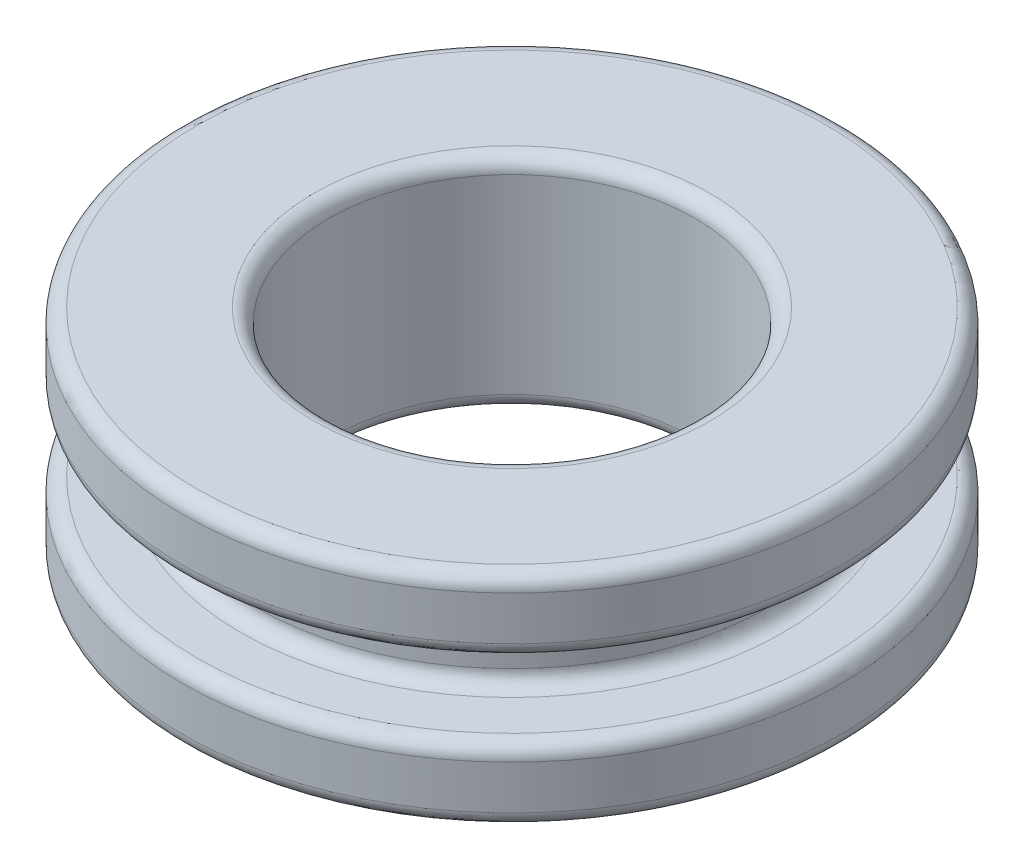
ISO-10303-21;
HEADER;
FILE_DESCRIPTION(('STEP AP214'),'2;1');
FILE_NAME('part.step','',(''),(''),'','','');
FILE_SCHEMA(('AUTOMOTIVE_DESIGN { 1 0 10303 214 1 1 1 1 }'));
ENDSEC;
DATA;
#1=APPLICATION_CONTEXT('core data for automotive mechanical design processes');
#2=APPLICATION_PROTOCOL_DEFINITION('international standard','automotive_design',2000,#1);
#3=PRODUCT_CONTEXT('',#1,'mechanical');
#4=PRODUCT('Part','Part','',(#3));
#5=PRODUCT_RELATED_PRODUCT_CATEGORY('part','',(#4));
#6=PRODUCT_DEFINITION_FORMATION('','',#4);
#7=PRODUCT_DEFINITION_CONTEXT('part definition',#1,'design');
#8=PRODUCT_DEFINITION('design','',#6,#7);
#9=PRODUCT_DEFINITION_SHAPE('','',#8);
#10=(LENGTH_UNIT() NAMED_UNIT(*) SI_UNIT(.MILLI.,.METRE.));
#11=(NAMED_UNIT(*) PLANE_ANGLE_UNIT() SI_UNIT($,.RADIAN.));
#12=(NAMED_UNIT(*) SI_UNIT($,.STERADIAN.) SOLID_ANGLE_UNIT());
#13=UNCERTAINTY_MEASURE_WITH_UNIT(LENGTH_MEASURE(1.E-05),#10,'distance_accuracy_value','');
#14=(GEOMETRIC_REPRESENTATION_CONTEXT(3) GLOBAL_UNCERTAINTY_ASSIGNED_CONTEXT((#13)) GLOBAL_UNIT_ASSIGNED_CONTEXT((#10,
#11,#12)) REPRESENTATION_CONTEXT('',''));
#15=CARTESIAN_POINT('',(0.,0.,0.));
#16=DIRECTION('',(0.,0.,1.));
#17=DIRECTION('',(1.,0.,0.));
#18=AXIS2_PLACEMENT_3D('',#15,#16,#17);
#19=CARTESIAN_POINT('',(0.,0.,0.));
#20=DIRECTION('',(0.,-1.,0.));
#21=DIRECTION('',(0.,0.,-1.));
#22=AXIS2_PLACEMENT_3D('',#19,#20,#21);
#23=CYLINDRICAL_SURFACE('',#22,7.9375);
#24=CARTESIAN_POINT('',(0.,8.89,0.));
#25=DIRECTION('',(0.,1.,0.));
#26=DIRECTION('',(0.,0.,1.));
#27=AXIS2_PLACEMENT_3D('',#24,#25,#26);
#28=CIRCLE('',#27,7.9375);
#29=CARTESIAN_POINT('',(0.,8.89,7.9375));
#30=VERTEX_POINT('',#29);
#31=EDGE_CURVE('E93',#30,#30,#28,.T.);
#32=ORIENTED_EDGE('',*,*,#31,.T.);
#33=EDGE_LOOP('',(#32));
#34=FACE_BOUND('',#33,.T.);
#35=CARTESIAN_POINT('',(0.,0.635,0.));
#36=DIRECTION('',(0.,-1.,0.));
#37=DIRECTION('',(0.,0.,-1.));
#38=AXIS2_PLACEMENT_3D('',#35,#36,#37);
#39=CIRCLE('',#38,7.9375);
#40=CARTESIAN_POINT('',(0.,0.635,-7.9375));
#41=VERTEX_POINT('',#40);
#42=EDGE_CURVE('E97',#41,#41,#39,.T.);
#43=ORIENTED_EDGE('',*,*,#42,.T.);
#44=EDGE_LOOP('',(#43));
#45=FACE_BOUND('',#44,.T.);
#46=ADVANCED_FACE('F37',(#34,#45),#23,.F.);
#47=CARTESIAN_POINT('',(7.9375,9.525,0.));
#48=DIRECTION('',(0.,1.,0.));
#49=DIRECTION('',(0.,0.,1.));
#50=AXIS2_PLACEMENT_3D('',#47,#48,#49);
#51=PLANE('',#50);
#52=CARTESIAN_POINT('',(0.,9.525,0.));
#53=DIRECTION('',(0.,1.,0.));
#54=DIRECTION('',(0.,0.,1.));
#55=AXIS2_PLACEMENT_3D('',#52,#53,#54);
#56=CIRCLE('',#55,8.5725);
#57=CARTESIAN_POINT('',(0.,9.525,8.5725));
#58=VERTEX_POINT('',#57);
#59=EDGE_CURVE('E101',#58,#58,#56,.F.);
#60=ORIENTED_EDGE('',*,*,#59,.T.);
#61=EDGE_LOOP('',(#60));
#62=FACE_BOUND('',#61,.T.);
#63=CARTESIAN_POINT('',(0.,9.525,0.));
#64=DIRECTION('',(0.,1.,0.));
#65=DIRECTION('',(0.,0.,1.));
#66=AXIS2_PLACEMENT_3D('',#63,#64,#65);
#67=CIRCLE('',#66,13.6525);
#68=CARTESIAN_POINT('',(0.,9.525,13.6525));
#69=VERTEX_POINT('',#68);
#70=EDGE_CURVE('E105',#69,#69,#67,.T.);
#71=ORIENTED_EDGE('',*,*,#70,.T.);
#72=EDGE_LOOP('',(#71));
#73=FACE_BOUND('',#72,.T.);
#74=ADVANCED_FACE('F110',(#62,#73),#51,.T.);
#75=CARTESIAN_POINT('',(0.,0.,0.));
#76=DIRECTION('',(0.,-1.,0.));
#77=DIRECTION('',(0.,0.,-1.));
#78=AXIS2_PLACEMENT_3D('',#75,#76,#77);
#79=CYLINDRICAL_SURFACE('',#78,14.2875);
#80=CARTESIAN_POINT('',(0.,6.985,0.));
#81=DIRECTION('',(0.,-1.,0.));
#82=DIRECTION('',(0.,0.,-1.));
#83=AXIS2_PLACEMENT_3D('',#80,#81,#82);
#84=CIRCLE('',#83,14.2875);
#85=CARTESIAN_POINT('',(0.,6.985,-14.2875));
#86=VERTEX_POINT('',#85);
#87=EDGE_CURVE('E10',#86,#86,#84,.F.);
#88=ORIENTED_EDGE('',*,*,#87,.T.);
#89=EDGE_LOOP('',(#88));
#90=FACE_BOUND('',#89,.T.);
#91=CARTESIAN_POINT('',(0.,8.89,0.));
#92=DIRECTION('',(0.,1.,0.));
#93=DIRECTION('',(0.,0.,1.));
#94=AXIS2_PLACEMENT_3D('',#91,#92,#93);
#95=CIRCLE('',#94,14.2875);
#96=CARTESIAN_POINT('',(0.,8.89,14.2875));
#97=VERTEX_POINT('',#96);
#98=EDGE_CURVE('E45',#97,#97,#95,.F.);
#99=ORIENTED_EDGE('',*,*,#98,.T.);
#100=EDGE_LOOP('',(#99));
#101=FACE_BOUND('',#100,.T.);
#102=ADVANCED_FACE('F126',(#90,#101),#79,.T.);
#103=CARTESIAN_POINT('',(14.2875,6.35,0.));
#104=DIRECTION('',(0.,-1.,0.));
#105=DIRECTION('',(0.,0.,-1.));
#106=AXIS2_PLACEMENT_3D('',#103,#104,#105);
#107=PLANE('',#106);
#108=CARTESIAN_POINT('',(0.,6.35,0.));
#109=DIRECTION('',(0.,-1.,0.));
#110=DIRECTION('',(0.,0.,-1.));
#111=AXIS2_PLACEMENT_3D('',#108,#109,#110);
#112=CIRCLE('',#111,11.7475);
#113=CARTESIAN_POINT('',(0.,6.35,-11.7475));
#114=VERTEX_POINT('',#113);
#115=EDGE_CURVE('E61',#114,#114,#112,.F.);
#116=ORIENTED_EDGE('',*,*,#115,.T.);
#117=EDGE_LOOP('',(#116));
#118=FACE_BOUND('',#117,.T.);
#119=CARTESIAN_POINT('',(0.,6.35,0.));
#120=DIRECTION('',(0.,-1.,0.));
#121=DIRECTION('',(0.,0.,-1.));
#122=AXIS2_PLACEMENT_3D('',#119,#120,#121);
#123=CIRCLE('',#122,13.6525);
#124=CARTESIAN_POINT('',(0.,6.35,-13.6525));
#125=VERTEX_POINT('',#124);
#126=EDGE_CURVE('E65',#125,#125,#123,.T.);
#127=ORIENTED_EDGE('',*,*,#126,.T.);
#128=EDGE_LOOP('',(#127));
#129=FACE_BOUND('',#128,.T.);
#130=ADVANCED_FACE('F178',(#118,#129),#107,.T.);
#131=CARTESIAN_POINT('',(0.,0.,0.));
#132=DIRECTION('',(0.,-1.,0.));
#133=DIRECTION('',(0.,0.,-1.));
#134=AXIS2_PLACEMENT_3D('',#131,#132,#133);
#135=CYLINDRICAL_SURFACE('',#134,11.1125);
#136=CARTESIAN_POINT('',(0.,3.81,0.));
#137=DIRECTION('',(0.,1.,0.));
#138=DIRECTION('',(0.,0.,1.));
#139=AXIS2_PLACEMENT_3D('',#136,#137,#138);
#140=CIRCLE('',#139,11.1125);
#141=CARTESIAN_POINT('',(0.,3.81,11.1125));
#142=VERTEX_POINT('',#141);
#143=EDGE_CURVE('E69',#142,#142,#140,.T.);
#144=ORIENTED_EDGE('',*,*,#143,.T.);
#145=EDGE_LOOP('',(#144));
#146=FACE_BOUND('',#145,.T.);
#147=CARTESIAN_POINT('',(0.,5.715,0.));
#148=DIRECTION('',(0.,-1.,0.));
#149=DIRECTION('',(0.,0.,-1.));
#150=AXIS2_PLACEMENT_3D('',#147,#148,#149);
#151=CIRCLE('',#150,11.1125);
#152=CARTESIAN_POINT('',(0.,5.715,-11.1125));
#153=VERTEX_POINT('',#152);
#154=EDGE_CURVE('E73',#153,#153,#151,.T.);
#155=ORIENTED_EDGE('',*,*,#154,.T.);
#156=EDGE_LOOP('',(#155));
#157=FACE_BOUND('',#156,.T.);
#158=ADVANCED_FACE('F172',(#146,#157),#135,.T.);
#159=CARTESIAN_POINT('',(11.1125,3.175,0.));
#160=DIRECTION('',(0.,1.,0.));
#161=DIRECTION('',(0.,0.,1.));
#162=AXIS2_PLACEMENT_3D('',#159,#160,#161);
#163=PLANE('',#162);
#164=CARTESIAN_POINT('',(0.,3.175,0.));
#165=DIRECTION('',(0.,1.,0.));
#166=DIRECTION('',(0.,0.,1.));
#167=AXIS2_PLACEMENT_3D('',#164,#165,#166);
#168=CIRCLE('',#167,11.7475);
#169=CARTESIAN_POINT('',(0.,3.175,11.7475));
#170=VERTEX_POINT('',#169);
#171=EDGE_CURVE('E77',#170,#170,#168,.F.);
#172=ORIENTED_EDGE('',*,*,#171,.T.);
#173=EDGE_LOOP('',(#172));
#174=FACE_BOUND('',#173,.T.);
#175=CARTESIAN_POINT('',(0.,3.175,0.));
#176=DIRECTION('',(0.,1.,0.));
#177=DIRECTION('',(0.,0.,1.));
#178=AXIS2_PLACEMENT_3D('',#175,#176,#177);
#179=CIRCLE('',#178,13.6525);
#180=CARTESIAN_POINT('',(0.,3.175,13.6525));
#181=VERTEX_POINT('',#180);
#182=EDGE_CURVE('E81',#181,#181,#179,.T.);
#183=ORIENTED_EDGE('',*,*,#182,.T.);
#184=EDGE_LOOP('',(#183));
#185=FACE_BOUND('',#184,.T.);
#186=ADVANCED_FACE('F163',(#174,#185),#163,.T.);
#187=CARTESIAN_POINT('',(0.,0.,0.));
#188=DIRECTION('',(0.,-1.,0.));
#189=DIRECTION('',(0.,0.,-1.));
#190=AXIS2_PLACEMENT_3D('',#187,#188,#189);
#191=CYLINDRICAL_SURFACE('',#190,14.2875);
#192=CARTESIAN_POINT('',(0.,0.635,0.));
#193=DIRECTION('',(0.,-1.,0.));
#194=DIRECTION('',(0.,0.,-1.));
#195=AXIS2_PLACEMENT_3D('',#192,#193,#194);
#196=CIRCLE('',#195,14.2875);
#197=CARTESIAN_POINT('',(0.,0.635,-14.2875));
#198=VERTEX_POINT('',#197);
#199=EDGE_CURVE('E50',#198,#198,#196,.F.);
#200=ORIENTED_EDGE('',*,*,#199,.T.);
#201=EDGE_LOOP('',(#200));
#202=FACE_BOUND('',#201,.T.);
#203=CARTESIAN_POINT('',(0.,2.54,0.));
#204=DIRECTION('',(0.,1.,0.));
#205=DIRECTION('',(0.,0.,1.));
#206=AXIS2_PLACEMENT_3D('',#203,#204,#205);
#207=CIRCLE('',#206,14.2875);
#208=CARTESIAN_POINT('',(0.,2.54,14.2875));
#209=VERTEX_POINT('',#208);
#210=EDGE_CURVE('E55',#209,#209,#207,.F.);
#211=ORIENTED_EDGE('',*,*,#210,.T.);
#212=EDGE_LOOP('',(#211));
#213=FACE_BOUND('',#212,.T.);
#214=ADVANCED_FACE('F161',(#202,#213),#191,.T.);
#215=CARTESIAN_POINT('',(7.9375,0.,0.));
#216=DIRECTION('',(0.,-1.,0.));
#217=DIRECTION('',(0.,0.,-1.));
#218=AXIS2_PLACEMENT_3D('',#215,#216,#217);
#219=PLANE('',#218);
#220=CARTESIAN_POINT('',(0.,0.,0.));
#221=DIRECTION('',(0.,-1.,0.));
#222=DIRECTION('',(0.,0.,-1.));
#223=AXIS2_PLACEMENT_3D('',#220,#221,#222);
#224=CIRCLE('',#223,8.5725);
#225=CARTESIAN_POINT('',(0.,0.,-8.5725));
#226=VERTEX_POINT('',#225);
#227=EDGE_CURVE('E85',#226,#226,#224,.F.);
#228=ORIENTED_EDGE('',*,*,#227,.T.);
#229=EDGE_LOOP('',(#228));
#230=FACE_BOUND('',#229,.T.);
#231=CARTESIAN_POINT('',(0.,0.,0.));
#232=DIRECTION('',(0.,-1.,0.));
#233=DIRECTION('',(0.,0.,-1.));
#234=AXIS2_PLACEMENT_3D('',#231,#232,#233);
#235=CIRCLE('',#234,13.6525);
#236=CARTESIAN_POINT('',(0.,0.,-13.6525));
#237=VERTEX_POINT('',#236);
#238=EDGE_CURVE('E89',#237,#237,#235,.T.);
#239=ORIENTED_EDGE('',*,*,#238,.T.);
#240=EDGE_LOOP('',(#239));
#241=FACE_BOUND('',#240,.T.);
#242=ADVANCED_FACE('F136',(#230,#241),#219,.T.);
#243=CARTESIAN_POINT('',(0.,8.89,0.));
#244=DIRECTION('',(0.,1.,0.));
#245=DIRECTION('',(0.,0.,1.));
#246=AXIS2_PLACEMENT_3D('',#243,#244,#245);
#247=TOROIDAL_SURFACE('',#246,8.5725,0.635);
#248=ORIENTED_EDGE('',*,*,#31,.F.);
#249=EDGE_LOOP('',(#248));
#250=FACE_BOUND('',#249,.T.);
#251=ORIENTED_EDGE('',*,*,#59,.F.);
#252=EDGE_LOOP('',(#251));
#253=FACE_BOUND('',#252,.T.);
#254=ADVANCED_FACE('F132',(#250,#253),#247,.T.);
#255=CARTESIAN_POINT('',(0.,0.635,0.));
#256=DIRECTION('',(0.,-1.,0.));
#257=DIRECTION('',(0.,0.,-1.));
#258=AXIS2_PLACEMENT_3D('',#255,#256,#257);
#259=TOROIDAL_SURFACE('',#258,8.5725,0.635);
#260=ORIENTED_EDGE('',*,*,#227,.F.);
#261=EDGE_LOOP('',(#260));
#262=FACE_BOUND('',#261,.T.);
#263=ORIENTED_EDGE('',*,*,#42,.F.);
#264=EDGE_LOOP('',(#263));
#265=FACE_BOUND('',#264,.T.);
#266=ADVANCED_FACE('F135',(#262,#265),#259,.T.);
#267=CARTESIAN_POINT('',(0.,3.81,0.));
#268=DIRECTION('',(0.,1.,0.));
#269=DIRECTION('',(0.,0.,1.));
#270=AXIS2_PLACEMENT_3D('',#267,#268,#269);
#271=TOROIDAL_SURFACE('',#270,11.7475,0.635);
#272=ORIENTED_EDGE('',*,*,#143,.F.);
#273=EDGE_LOOP('',(#272));
#274=FACE_BOUND('',#273,.T.);
#275=ORIENTED_EDGE('',*,*,#171,.F.);
#276=EDGE_LOOP('',(#275));
#277=FACE_BOUND('',#276,.T.);
#278=ADVANCED_FACE('F140',(#274,#277),#271,.F.);
#279=CARTESIAN_POINT('',(0.,5.715,0.));
#280=DIRECTION('',(0.,-1.,0.));
#281=DIRECTION('',(0.,0.,-1.));
#282=AXIS2_PLACEMENT_3D('',#279,#280,#281);
#283=TOROIDAL_SURFACE('',#282,11.7475,0.635);
#284=ORIENTED_EDGE('',*,*,#115,.F.);
#285=EDGE_LOOP('',(#284));
#286=FACE_BOUND('',#285,.T.);
#287=ORIENTED_EDGE('',*,*,#154,.F.);
#288=EDGE_LOOP('',(#287));
#289=FACE_BOUND('',#288,.T.);
#290=ADVANCED_FACE('F144',(#286,#289),#283,.F.);
#291=CARTESIAN_POINT('',(0.,0.635,0.));
#292=DIRECTION('',(0.,-1.,0.));
#293=DIRECTION('',(0.,0.,-1.));
#294=AXIS2_PLACEMENT_3D('',#291,#292,#293);
#295=TOROIDAL_SURFACE('',#294,13.6525,0.635);
#296=ORIENTED_EDGE('',*,*,#199,.F.);
#297=EDGE_LOOP('',(#296));
#298=FACE_BOUND('',#297,.T.);
#299=ORIENTED_EDGE('',*,*,#238,.F.);
#300=EDGE_LOOP('',(#299));
#301=FACE_BOUND('',#300,.T.);
#302=ADVANCED_FACE('F148',(#298,#301),#295,.T.);
#303=CARTESIAN_POINT('',(0.,2.54,0.));
#304=DIRECTION('',(0.,1.,0.));
#305=DIRECTION('',(0.,0.,1.));
#306=AXIS2_PLACEMENT_3D('',#303,#304,#305);
#307=TOROIDAL_SURFACE('',#306,13.6525,0.635);
#308=ORIENTED_EDGE('',*,*,#182,.F.);
#309=EDGE_LOOP('',(#308));
#310=FACE_BOUND('',#309,.T.);
#311=ORIENTED_EDGE('',*,*,#210,.F.);
#312=EDGE_LOOP('',(#311));
#313=FACE_BOUND('',#312,.T.);
#314=ADVANCED_FACE('F118',(#310,#313),#307,.T.);
#315=CARTESIAN_POINT('',(0.,6.985,0.));
#316=DIRECTION('',(0.,-1.,0.));
#317=DIRECTION('',(0.,0.,-1.));
#318=AXIS2_PLACEMENT_3D('',#315,#316,#317);
#319=TOROIDAL_SURFACE('',#318,13.6525,0.635);
#320=ORIENTED_EDGE('',*,*,#87,.F.);
#321=EDGE_LOOP('',(#320));
#322=FACE_BOUND('',#321,.T.);
#323=ORIENTED_EDGE('',*,*,#126,.F.);
#324=EDGE_LOOP('',(#323));
#325=FACE_BOUND('',#324,.T.);
#326=ADVANCED_FACE('F114',(#322,#325),#319,.T.);
#327=CARTESIAN_POINT('',(0.,8.89,0.));
#328=DIRECTION('',(0.,1.,0.));
#329=DIRECTION('',(0.,0.,1.));
#330=AXIS2_PLACEMENT_3D('',#327,#328,#329);
#331=TOROIDAL_SURFACE('',#330,13.6525,0.635);
#332=ORIENTED_EDGE('',*,*,#70,.F.);
#333=EDGE_LOOP('',(#332));
#334=FACE_BOUND('',#333,.T.);
#335=ORIENTED_EDGE('',*,*,#98,.F.);
#336=EDGE_LOOP('',(#335));
#337=FACE_BOUND('',#336,.T.);
#338=ADVANCED_FACE('F39',(#334,#337),#331,.T.);
#339=CLOSED_SHELL('',(#46,#74,#102,#130,#158,#186,#214,#242,#254,#266,#278,#290,#302,#314,#326,#338));
#340=MANIFOLD_SOLID_BREP('B2',#339);
#341=ADVANCED_BREP_SHAPE_REPRESENTATION('',(#18,#340),#14);
#342=SHAPE_DEFINITION_REPRESENTATION(#9,#341);
ENDSEC;
END-ISO-10303-21;
